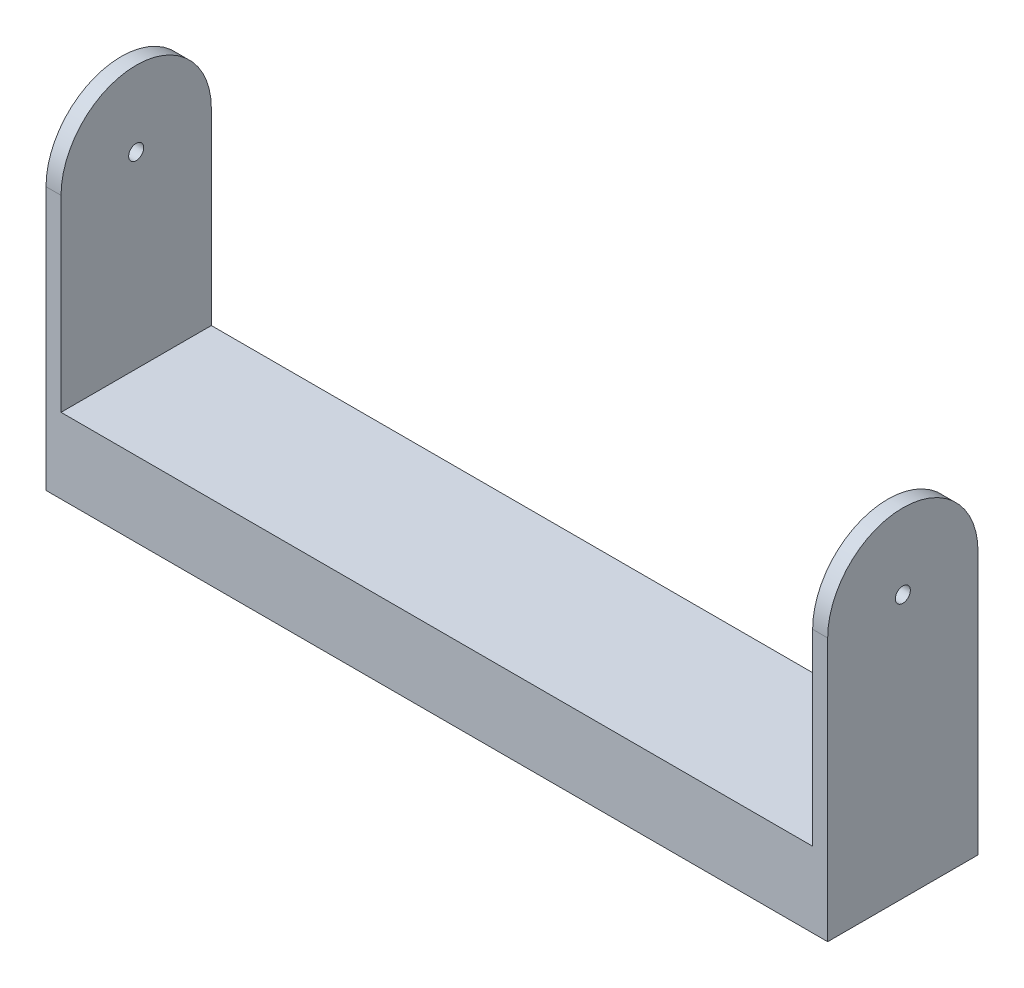
ISO-10303-21;
HEADER;
FILE_DESCRIPTION(('STEP AP214'),'2;1');
FILE_NAME('part.step','',(''),(''),'','','');
FILE_SCHEMA(('AUTOMOTIVE_DESIGN { 1 0 10303 214 1 1 1 1 }'));
ENDSEC;
DATA;
#1=APPLICATION_CONTEXT('core data for automotive mechanical design processes');
#2=APPLICATION_PROTOCOL_DEFINITION('international standard','automotive_design',2000,#1);
#3=PRODUCT_CONTEXT('',#1,'mechanical');
#4=PRODUCT('Part','Part','',(#3));
#5=PRODUCT_RELATED_PRODUCT_CATEGORY('part','',(#4));
#6=PRODUCT_DEFINITION_FORMATION('','',#4);
#7=PRODUCT_DEFINITION_CONTEXT('part definition',#1,'design');
#8=PRODUCT_DEFINITION('design','',#6,#7);
#9=PRODUCT_DEFINITION_SHAPE('','',#8);
#10=(LENGTH_UNIT() NAMED_UNIT(*) SI_UNIT(.MILLI.,.METRE.));
#11=(NAMED_UNIT(*) PLANE_ANGLE_UNIT() SI_UNIT($,.RADIAN.));
#12=(NAMED_UNIT(*) SI_UNIT($,.STERADIAN.) SOLID_ANGLE_UNIT());
#13=UNCERTAINTY_MEASURE_WITH_UNIT(LENGTH_MEASURE(1.E-05),#10,'distance_accuracy_value','');
#14=(GEOMETRIC_REPRESENTATION_CONTEXT(3) GLOBAL_UNCERTAINTY_ASSIGNED_CONTEXT((#13)) GLOBAL_UNIT_ASSIGNED_CONTEXT((#10,
#11,#12)) REPRESENTATION_CONTEXT('',''));
#15=CARTESIAN_POINT('',(0.,0.,0.));
#16=DIRECTION('',(0.,0.,1.));
#17=DIRECTION('',(1.,0.,0.));
#18=AXIS2_PLACEMENT_3D('',#15,#16,#17);
#19=CARTESIAN_POINT('',(0.,0.,200.));
#20=DIRECTION('',(1.,0.,0.));
#21=DIRECTION('',(0.,1.,0.));
#22=AXIS2_PLACEMENT_3D('',#19,#20,#21);
#23=PLANE('',#22);
#24=CARTESIAN_POINT('',(0.,250.,100.));
#25=DIRECTION('',(1.,0.,0.));
#26=DIRECTION('',(0.,1.,0.));
#27=AXIS2_PLACEMENT_3D('',#24,#25,#26);
#28=CIRCLE('',#27,10.);
#29=CARTESIAN_POINT('',(0.,260.,100.));
#30=VERTEX_POINT('',#29);
#31=EDGE_CURVE('E192',#30,#30,#28,.T.);
#32=ORIENTED_EDGE('',*,*,#31,.T.);
#33=EDGE_LOOP('',(#32));
#34=FACE_BOUND('',#33,.T.);
#35=DIRECTION('',(0.,-1.,0.));
#36=VECTOR('',#35,1.);
#37=CARTESIAN_POINT('',(0.,0.,0.));
#38=LINE('',#37,#36);
#39=CARTESIAN_POINT('',(0.,250.,0.));
#40=VERTEX_POINT('',#39);
#41=CARTESIAN_POINT('',(0.,-100.,0.));
#42=VERTEX_POINT('',#41);
#43=EDGE_CURVE('E151',#40,#42,#38,.T.);
#44=ORIENTED_EDGE('',*,*,#43,.T.);
#45=DIRECTION('',(0.,0.,-1.));
#46=VECTOR('',#45,1.);
#47=CARTESIAN_POINT('',(0.,-100.,200.));
#48=LINE('',#47,#46);
#49=CARTESIAN_POINT('',(0.,-100.,200.));
#50=VERTEX_POINT('',#49);
#51=EDGE_CURVE('E11',#50,#42,#48,.T.);
#52=ORIENTED_EDGE('',*,*,#51,.F.);
#53=DIRECTION('',(0.,-1.,0.));
#54=VECTOR('',#53,1.);
#55=CARTESIAN_POINT('',(0.,0.,200.));
#56=LINE('',#55,#54);
#57=CARTESIAN_POINT('',(0.,250.,200.));
#58=VERTEX_POINT('',#57);
#59=EDGE_CURVE('E154',#58,#50,#56,.T.);
#60=ORIENTED_EDGE('',*,*,#59,.F.);
#61=CARTESIAN_POINT('',(0.,250.,100.));
#62=DIRECTION('',(1.,0.,0.));
#63=DIRECTION('',(0.,0.,1.));
#64=AXIS2_PLACEMENT_3D('',#61,#62,#63);
#65=CIRCLE('',#64,100.);
#66=EDGE_CURVE('E118',#40,#58,#65,.T.);
#67=ORIENTED_EDGE('',*,*,#66,.F.);
#68=EDGE_LOOP('',(#44,#52,#60,#67));
#69=FACE_BOUND('',#68,.T.);
#70=ADVANCED_FACE('F37',(#34,#69),#23,.F.);
#71=CARTESIAN_POINT('',(0.,-100.,200.));
#72=DIRECTION('',(0.,1.,0.));
#73=DIRECTION('',(0.,0.,1.));
#74=AXIS2_PLACEMENT_3D('',#71,#72,#73);
#75=PLANE('',#74);
#76=DIRECTION('',(1.,0.,0.));
#77=VECTOR('',#76,1.);
#78=CARTESIAN_POINT('',(0.,-100.,0.));
#79=LINE('',#78,#77);
#80=CARTESIAN_POINT('',(1040.,-100.,0.));
#81=VERTEX_POINT('',#80);
#82=EDGE_CURVE('E163',#42,#81,#79,.T.);
#83=ORIENTED_EDGE('',*,*,#82,.T.);
#84=DIRECTION('',(0.,0.,-1.));
#85=VECTOR('',#84,1.);
#86=CARTESIAN_POINT('',(1040.,-100.,200.));
#87=LINE('',#86,#85);
#88=CARTESIAN_POINT('',(1040.,-100.,200.));
#89=VERTEX_POINT('',#88);
#90=EDGE_CURVE('E45',#89,#81,#87,.T.);
#91=ORIENTED_EDGE('',*,*,#90,.F.);
#92=DIRECTION('',(1.,0.,0.));
#93=VECTOR('',#92,1.);
#94=CARTESIAN_POINT('',(0.,-100.,200.));
#95=LINE('',#94,#93);
#96=EDGE_CURVE('E156',#50,#89,#95,.T.);
#97=ORIENTED_EDGE('',*,*,#96,.F.);
#98=ORIENTED_EDGE('',*,*,#51,.T.);
#99=EDGE_LOOP('',(#83,#91,#97,#98));
#100=FACE_BOUND('',#99,.T.);
#101=ADVANCED_FACE('F183',(#100),#75,.F.);
#102=CARTESIAN_POINT('',(1040.,0.,200.));
#103=DIRECTION('',(-1.,0.,0.));
#104=DIRECTION('',(0.,0.,1.));
#105=AXIS2_PLACEMENT_3D('',#102,#103,#104);
#106=PLANE('',#105);
#107=CARTESIAN_POINT('',(1040.,250.,100.));
#108=DIRECTION('',(1.,0.,0.));
#109=DIRECTION('',(0.,1.,0.));
#110=AXIS2_PLACEMENT_3D('',#107,#108,#109);
#111=CIRCLE('',#110,10.);
#112=CARTESIAN_POINT('',(1040.,260.,100.));
#113=VERTEX_POINT('',#112);
#114=EDGE_CURVE('E194',#113,#113,#111,.T.);
#115=ORIENTED_EDGE('',*,*,#114,.F.);
#116=EDGE_LOOP('',(#115));
#117=FACE_BOUND('',#116,.T.);
#118=DIRECTION('',(0.,1.,0.));
#119=VECTOR('',#118,1.);
#120=CARTESIAN_POINT('',(1040.,0.,0.));
#121=LINE('',#120,#119);
#122=CARTESIAN_POINT('',(1040.,250.,0.));
#123=VERTEX_POINT('',#122);
#124=EDGE_CURVE('E165',#81,#123,#121,.T.);
#125=ORIENTED_EDGE('',*,*,#124,.T.);
#126=CARTESIAN_POINT('',(1040.,250.,100.));
#127=DIRECTION('',(1.,0.,0.));
#128=DIRECTION('',(0.,0.,1.));
#129=AXIS2_PLACEMENT_3D('',#126,#127,#128);
#130=CIRCLE('',#129,100.);
#131=CARTESIAN_POINT('',(1040.,250.,200.));
#132=VERTEX_POINT('',#131);
#133=EDGE_CURVE('E133',#123,#132,#130,.T.);
#134=ORIENTED_EDGE('',*,*,#133,.T.);
#135=DIRECTION('',(0.,1.,0.));
#136=VECTOR('',#135,1.);
#137=CARTESIAN_POINT('',(1040.,0.,200.));
#138=LINE('',#137,#136);
#139=EDGE_CURVE('E158',#89,#132,#138,.T.);
#140=ORIENTED_EDGE('',*,*,#139,.F.);
#141=ORIENTED_EDGE('',*,*,#90,.T.);
#142=EDGE_LOOP('',(#125,#134,#140,#141));
#143=FACE_BOUND('',#142,.T.);
#144=ADVANCED_FACE('F173',(#117,#143),#106,.F.);
#145=CARTESIAN_POINT('',(0.,0.,200.));
#146=DIRECTION('',(0.,-1.,0.));
#147=DIRECTION('',(0.,0.,-1.));
#148=AXIS2_PLACEMENT_3D('',#145,#146,#147);
#149=PLANE('',#148);
#150=DIRECTION('',(-1.,0.,0.));
#151=VECTOR('',#150,1.);
#152=CARTESIAN_POINT('',(0.,0.,0.));
#153=LINE('',#152,#151);
#154=CARTESIAN_POINT('',(1020.,0.,0.));
#155=VERTEX_POINT('',#154);
#156=CARTESIAN_POINT('',(20.,0.,0.));
#157=VERTEX_POINT('',#156);
#158=EDGE_CURVE('E57',#155,#157,#153,.T.);
#159=ORIENTED_EDGE('',*,*,#158,.T.);
#160=DIRECTION('',(0.,0.,-1.));
#161=VECTOR('',#160,1.);
#162=CARTESIAN_POINT('',(20.,0.,0.));
#163=LINE('',#162,#161);
#164=CARTESIAN_POINT('',(20.,0.,200.));
#165=VERTEX_POINT('',#164);
#166=EDGE_CURVE('E52',#165,#157,#163,.T.);
#167=ORIENTED_EDGE('',*,*,#166,.F.);
#168=DIRECTION('',(-1.,0.,0.));
#169=VECTOR('',#168,1.);
#170=CARTESIAN_POINT('',(0.,0.,200.));
#171=LINE('',#170,#169);
#172=CARTESIAN_POINT('',(1020.,0.,200.));
#173=VERTEX_POINT('',#172);
#174=EDGE_CURVE('E125',#173,#165,#171,.T.);
#175=ORIENTED_EDGE('',*,*,#174,.F.);
#176=DIRECTION('',(0.,0.,-1.));
#177=VECTOR('',#176,1.);
#178=CARTESIAN_POINT('',(1020.,0.,0.));
#179=LINE('',#178,#177);
#180=EDGE_CURVE('E135',#173,#155,#179,.T.);
#181=ORIENTED_EDGE('',*,*,#180,.T.);
#182=EDGE_LOOP('',(#159,#167,#175,#181));
#183=FACE_BOUND('',#182,.T.);
#184=ADVANCED_FACE('F209',(#183),#149,.F.);
#185=CARTESIAN_POINT('',(0.,0.,200.));
#186=DIRECTION('',(0.,0.,1.));
#187=DIRECTION('',(1.,0.,0.));
#188=AXIS2_PLACEMENT_3D('',#185,#186,#187);
#189=PLANE('',#188);
#190=ORIENTED_EDGE('',*,*,#59,.T.);
#191=ORIENTED_EDGE('',*,*,#96,.T.);
#192=ORIENTED_EDGE('',*,*,#139,.T.);
#193=DIRECTION('',(1.,0.,0.));
#194=VECTOR('',#193,1.);
#195=CARTESIAN_POINT('',(1020.,250.,200.));
#196=LINE('',#195,#194);
#197=CARTESIAN_POINT('',(1020.,250.,200.));
#198=VERTEX_POINT('',#197);
#199=EDGE_CURVE('E148',#198,#132,#196,.T.);
#200=ORIENTED_EDGE('',*,*,#199,.F.);
#201=DIRECTION('',(0.,-1.,0.));
#202=VECTOR('',#201,1.);
#203=CARTESIAN_POINT('',(1020.,0.,200.));
#204=LINE('',#203,#202);
#205=EDGE_CURVE('E143',#198,#173,#204,.T.);
#206=ORIENTED_EDGE('',*,*,#205,.T.);
#207=ORIENTED_EDGE('',*,*,#174,.T.);
#208=DIRECTION('',(0.,-1.,0.));
#209=VECTOR('',#208,1.);
#210=CARTESIAN_POINT('',(20.,0.,200.));
#211=LINE('',#210,#209);
#212=CARTESIAN_POINT('',(20.,250.,200.));
#213=VERTEX_POINT('',#212);
#214=EDGE_CURVE('E107',#213,#165,#211,.T.);
#215=ORIENTED_EDGE('',*,*,#214,.F.);
#216=DIRECTION('',(-1.,0.,0.));
#217=VECTOR('',#216,1.);
#218=CARTESIAN_POINT('',(20.,250.,200.));
#219=LINE('',#218,#217);
#220=EDGE_CURVE('E115',#213,#58,#219,.T.);
#221=ORIENTED_EDGE('',*,*,#220,.T.);
#222=EDGE_LOOP('',(#190,#191,#192,#200,#206,#207,#215,#221));
#223=FACE_BOUND('',#222,.T.);
#224=ADVANCED_FACE('F123',(#223),#189,.T.);
#225=CARTESIAN_POINT('',(0.,0.,0.));
#226=DIRECTION('',(0.,0.,1.));
#227=DIRECTION('',(1.,0.,0.));
#228=AXIS2_PLACEMENT_3D('',#225,#226,#227);
#229=PLANE('',#228);
#230=ORIENTED_EDGE('',*,*,#43,.F.);
#231=DIRECTION('',(-1.,0.,0.));
#232=VECTOR('',#231,1.);
#233=CARTESIAN_POINT('',(20.,250.,0.));
#234=LINE('',#233,#232);
#235=CARTESIAN_POINT('',(20.,250.,0.));
#236=VERTEX_POINT('',#235);
#237=EDGE_CURVE('E121',#236,#40,#234,.T.);
#238=ORIENTED_EDGE('',*,*,#237,.F.);
#239=DIRECTION('',(0.,1.,0.));
#240=VECTOR('',#239,1.);
#241=CARTESIAN_POINT('',(20.,250.,0.));
#242=LINE('',#241,#240);
#243=EDGE_CURVE('E108',#157,#236,#242,.T.);
#244=ORIENTED_EDGE('',*,*,#243,.F.);
#245=ORIENTED_EDGE('',*,*,#158,.F.);
#246=DIRECTION('',(0.,1.,0.));
#247=VECTOR('',#246,1.);
#248=CARTESIAN_POINT('',(1020.,250.,0.));
#249=LINE('',#248,#247);
#250=CARTESIAN_POINT('',(1020.,250.,0.));
#251=VERTEX_POINT('',#250);
#252=EDGE_CURVE('E137',#155,#251,#249,.T.);
#253=ORIENTED_EDGE('',*,*,#252,.T.);
#254=DIRECTION('',(1.,0.,0.));
#255=VECTOR('',#254,1.);
#256=CARTESIAN_POINT('',(1020.,250.,0.));
#257=LINE('',#256,#255);
#258=EDGE_CURVE('E145',#251,#123,#257,.T.);
#259=ORIENTED_EDGE('',*,*,#258,.T.);
#260=ORIENTED_EDGE('',*,*,#124,.F.);
#261=ORIENTED_EDGE('',*,*,#82,.F.);
#262=EDGE_LOOP('',(#230,#238,#244,#245,#253,#259,#260,#261));
#263=FACE_BOUND('',#262,.T.);
#264=ADVANCED_FACE('F176',(#263),#229,.F.);
#265=CARTESIAN_POINT('',(1020.,250.,100.));
#266=DIRECTION('',(1.,0.,0.));
#267=DIRECTION('',(0.,0.,-1.));
#268=AXIS2_PLACEMENT_3D('',#265,#266,#267);
#269=CYLINDRICAL_SURFACE('',#268,100.);
#270=ORIENTED_EDGE('',*,*,#133,.F.);
#271=ORIENTED_EDGE('',*,*,#258,.F.);
#272=CARTESIAN_POINT('',(1020.,250.,100.));
#273=DIRECTION('',(1.,0.,0.));
#274=DIRECTION('',(0.,0.,1.));
#275=AXIS2_PLACEMENT_3D('',#272,#273,#274);
#276=CIRCLE('',#275,100.);
#277=EDGE_CURVE('E140',#251,#198,#276,.T.);
#278=ORIENTED_EDGE('',*,*,#277,.T.);
#279=ORIENTED_EDGE('',*,*,#199,.T.);
#280=EDGE_LOOP('',(#270,#271,#278,#279));
#281=FACE_BOUND('',#280,.T.);
#282=ADVANCED_FACE('F180',(#281),#269,.T.);
#283=CARTESIAN_POINT('',(1020.,250.,100.));
#284=DIRECTION('',(-1.,0.,0.));
#285=DIRECTION('',(0.,0.,1.));
#286=AXIS2_PLACEMENT_3D('',#283,#284,#285);
#287=PLANE('',#286);
#288=CARTESIAN_POINT('',(1020.,250.,100.));
#289=DIRECTION('',(-1.,0.,0.));
#290=DIRECTION('',(0.,0.,1.));
#291=AXIS2_PLACEMENT_3D('',#288,#289,#290);
#292=CIRCLE('',#291,10.);
#293=CARTESIAN_POINT('',(1020.,250.,110.));
#294=VERTEX_POINT('',#293);
#295=EDGE_CURVE('E132',#294,#294,#292,.T.);
#296=ORIENTED_EDGE('',*,*,#295,.F.);
#297=EDGE_LOOP('',(#296));
#298=FACE_BOUND('',#297,.T.);
#299=ORIENTED_EDGE('',*,*,#180,.F.);
#300=ORIENTED_EDGE('',*,*,#205,.F.);
#301=ORIENTED_EDGE('',*,*,#277,.F.);
#302=ORIENTED_EDGE('',*,*,#252,.F.);
#303=EDGE_LOOP('',(#299,#300,#301,#302));
#304=FACE_BOUND('',#303,.T.);
#305=ADVANCED_FACE('F205',(#298,#304),#287,.T.);
#306=CARTESIAN_POINT('',(20.,250.,100.));
#307=DIRECTION('',(-1.,0.,0.));
#308=DIRECTION('',(0.,-1.,0.));
#309=AXIS2_PLACEMENT_3D('',#306,#307,#308);
#310=CYLINDRICAL_SURFACE('',#309,100.);
#311=ORIENTED_EDGE('',*,*,#66,.T.);
#312=ORIENTED_EDGE('',*,*,#220,.F.);
#313=CARTESIAN_POINT('',(20.,250.,100.));
#314=DIRECTION('',(1.,0.,0.));
#315=DIRECTION('',(0.,0.,1.));
#316=AXIS2_PLACEMENT_3D('',#313,#314,#315);
#317=CIRCLE('',#316,100.);
#318=EDGE_CURVE('E103',#236,#213,#317,.T.);
#319=ORIENTED_EDGE('',*,*,#318,.F.);
#320=ORIENTED_EDGE('',*,*,#237,.T.);
#321=EDGE_LOOP('',(#311,#312,#319,#320));
#322=FACE_BOUND('',#321,.T.);
#323=ADVANCED_FACE('F116',(#322),#310,.T.);
#324=CARTESIAN_POINT('',(20.,250.,100.));
#325=DIRECTION('',(1.,0.,0.));
#326=DIRECTION('',(0.,0.,1.));
#327=AXIS2_PLACEMENT_3D('',#324,#325,#326);
#328=PLANE('',#327);
#329=CARTESIAN_POINT('',(20.,250.,100.));
#330=DIRECTION('',(1.,0.,0.));
#331=DIRECTION('',(0.,1.,0.));
#332=AXIS2_PLACEMENT_3D('',#329,#330,#331);
#333=CIRCLE('',#332,10.);
#334=CARTESIAN_POINT('',(20.,260.,100.));
#335=VERTEX_POINT('',#334);
#336=EDGE_CURVE('E40',#335,#335,#333,.T.);
#337=ORIENTED_EDGE('',*,*,#336,.F.);
#338=EDGE_LOOP('',(#337));
#339=FACE_BOUND('',#338,.T.);
#340=ORIENTED_EDGE('',*,*,#166,.T.);
#341=ORIENTED_EDGE('',*,*,#243,.T.);
#342=ORIENTED_EDGE('',*,*,#318,.T.);
#343=ORIENTED_EDGE('',*,*,#214,.T.);
#344=EDGE_LOOP('',(#340,#341,#342,#343));
#345=FACE_BOUND('',#344,.T.);
#346=ADVANCED_FACE('F105',(#339,#345),#328,.T.);
#347=CARTESIAN_POINT('',(0.,250.,100.));
#348=DIRECTION('',(1.,0.,0.));
#349=DIRECTION('',(0.,1.,0.));
#350=AXIS2_PLACEMENT_3D('',#347,#348,#349);
#351=CYLINDRICAL_SURFACE('',#350,10.);
#352=ORIENTED_EDGE('',*,*,#336,.T.);
#353=EDGE_LOOP('',(#352));
#354=FACE_BOUND('',#353,.T.);
#355=ORIENTED_EDGE('',*,*,#31,.F.);
#356=EDGE_LOOP('',(#355));
#357=FACE_BOUND('',#356,.T.);
#358=ADVANCED_FACE('F228',(#354,#357),#351,.F.);
#359=ORIENTED_EDGE('',*,*,#295,.T.);
#360=EDGE_LOOP('',(#359));
#361=FACE_BOUND('',#360,.T.);
#362=ORIENTED_EDGE('',*,*,#114,.T.);
#363=EDGE_LOOP('',(#362));
#364=FACE_BOUND('',#363,.T.);
#365=ADVANCED_FACE('F202',(#361,#364),#351,.F.);
#366=CLOSED_SHELL('',(#70,#101,#144,#184,#224,#264,#282,#305,#323,#346,#358,#365));
#367=MANIFOLD_SOLID_BREP('B2',#366);
#368=ADVANCED_BREP_SHAPE_REPRESENTATION('',(#18,#367),#14);
#369=SHAPE_DEFINITION_REPRESENTATION(#9,#368);
ENDSEC;
END-ISO-10303-21;
